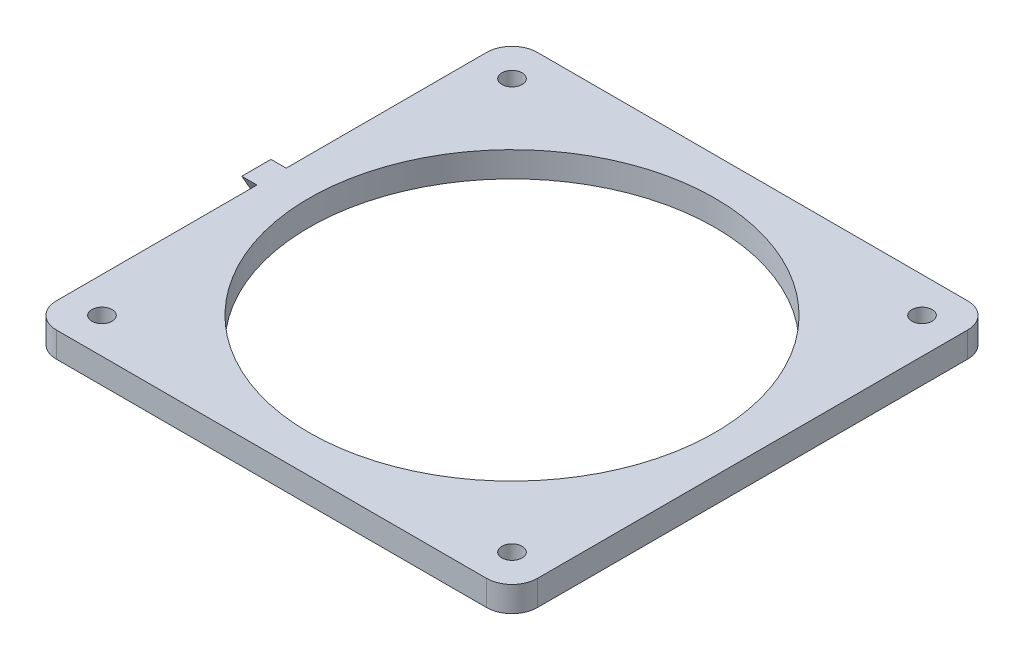
ISO-10303-21;
HEADER;
FILE_DESCRIPTION(('STEP AP214'),'2;1');
FILE_NAME('part.step','',(''),(''),'','','');
FILE_SCHEMA(('AUTOMOTIVE_DESIGN { 1 0 10303 214 1 1 1 1 }'));
ENDSEC;
DATA;
#1=APPLICATION_CONTEXT('core data for automotive mechanical design processes');
#2=APPLICATION_PROTOCOL_DEFINITION('international standard','automotive_design',2000,#1);
#3=PRODUCT_CONTEXT('',#1,'mechanical');
#4=PRODUCT('Part','Part','',(#3));
#5=PRODUCT_RELATED_PRODUCT_CATEGORY('part','',(#4));
#6=PRODUCT_DEFINITION_FORMATION('','',#4);
#7=PRODUCT_DEFINITION_CONTEXT('part definition',#1,'design');
#8=PRODUCT_DEFINITION('design','',#6,#7);
#9=PRODUCT_DEFINITION_SHAPE('','',#8);
#10=(LENGTH_UNIT() NAMED_UNIT(*) SI_UNIT(.MILLI.,.METRE.));
#11=(NAMED_UNIT(*) PLANE_ANGLE_UNIT() SI_UNIT($,.RADIAN.));
#12=(NAMED_UNIT(*) SI_UNIT($,.STERADIAN.) SOLID_ANGLE_UNIT());
#13=UNCERTAINTY_MEASURE_WITH_UNIT(LENGTH_MEASURE(1.E-05),#10,'distance_accuracy_value','');
#14=(GEOMETRIC_REPRESENTATION_CONTEXT(3) GLOBAL_UNCERTAINTY_ASSIGNED_CONTEXT((#13)) GLOBAL_UNIT_ASSIGNED_CONTEXT((#10,
#11,#12)) REPRESENTATION_CONTEXT('',''));
#15=CARTESIAN_POINT('',(0.,0.,0.));
#16=DIRECTION('',(0.,0.,1.));
#17=DIRECTION('',(1.,0.,0.));
#18=AXIS2_PLACEMENT_3D('',#15,#16,#17);
#19=CARTESIAN_POINT('',(-47.5,5.,0.));
#20=DIRECTION('',(-1.,0.,0.));
#21=DIRECTION('',(0.,0.,1.));
#22=AXIS2_PLACEMENT_3D('',#19,#20,#21);
#23=PLANE('',#22);
#24=DIRECTION('',(0.,0.,-1.));
#25=VECTOR('',#24,1.);
#26=CARTESIAN_POINT('',(-47.5,0.,0.));
#27=LINE('',#26,#25);
#28=CARTESIAN_POINT('',(-47.5,0.,42.5));
#29=VERTEX_POINT('',#28);
#30=CARTESIAN_POINT('',(-47.5,0.,0.));
#31=VERTEX_POINT('',#30);
#32=EDGE_CURVE('E185',#29,#31,#27,.T.);
#33=ORIENTED_EDGE('',*,*,#32,.F.);
#34=DIRECTION('',(0.,-1.,0.));
#35=VECTOR('',#34,1.);
#36=CARTESIAN_POINT('',(-47.5,5.,42.5));
#37=LINE('',#36,#35);
#38=CARTESIAN_POINT('',(-47.5,5.,42.5));
#39=VERTEX_POINT('',#38);
#40=EDGE_CURVE('E11',#29,#39,#37,.F.);
#41=ORIENTED_EDGE('',*,*,#40,.T.);
#42=DIRECTION('',(0.,0.,-1.));
#43=VECTOR('',#42,1.);
#44=CARTESIAN_POINT('',(-47.5,5.,0.));
#45=LINE('',#44,#43);
#46=CARTESIAN_POINT('',(-47.5,5.,2.88675134594816));
#47=VERTEX_POINT('',#46);
#48=EDGE_CURVE('E194',#39,#47,#45,.T.);
#49=ORIENTED_EDGE('',*,*,#48,.T.);
#50=DIRECTION('',(0.,0.866025403784435,0.500000000000005));
#51=VECTOR('',#50,1.);
#52=CARTESIAN_POINT('',(-47.5,5.,2.88675134594816));
#53=LINE('',#52,#51);
#54=EDGE_CURVE('E150',#31,#47,#53,.T.);
#55=ORIENTED_EDGE('',*,*,#54,.F.);
#56=EDGE_LOOP('',(#33,#41,#49,#55));
#57=FACE_BOUND('',#56,.T.);
#58=ADVANCED_FACE('F41',(#57),#23,.T.);
#59=CARTESIAN_POINT('',(0.,5.,0.));
#60=DIRECTION('',(0.,1.,0.));
#61=DIRECTION('',(0.,0.,1.));
#62=AXIS2_PLACEMENT_3D('',#59,#60,#61);
#63=PLANE('',#62);
#64=CARTESIAN_POINT('',(-40.5,5.,40.5));
#65=DIRECTION('',(0.,-1.,0.));
#66=DIRECTION('',(0.,0.,-1.));
#67=AXIS2_PLACEMENT_3D('',#64,#65,#66);
#68=CIRCLE('',#67,2.);
#69=CARTESIAN_POINT('',(-40.5,5.,38.5));
#70=VERTEX_POINT('',#69);
#71=EDGE_CURVE('E154',#70,#70,#68,.T.);
#72=ORIENTED_EDGE('',*,*,#71,.T.);
#73=EDGE_LOOP('',(#72));
#74=FACE_BOUND('',#73,.T.);
#75=CARTESIAN_POINT('',(40.5,5.,40.5));
#76=DIRECTION('',(0.,-1.,0.));
#77=DIRECTION('',(0.,0.,-1.));
#78=AXIS2_PLACEMENT_3D('',#75,#76,#77);
#79=CIRCLE('',#78,2.);
#80=CARTESIAN_POINT('',(40.5,5.,38.5));
#81=VERTEX_POINT('',#80);
#82=EDGE_CURVE('E165',#81,#81,#79,.T.);
#83=ORIENTED_EDGE('',*,*,#82,.T.);
#84=EDGE_LOOP('',(#83));
#85=FACE_BOUND('',#84,.T.);
#86=CARTESIAN_POINT('',(40.5,5.,-40.5));
#87=DIRECTION('',(0.,-1.,0.));
#88=DIRECTION('',(0.,0.,-1.));
#89=AXIS2_PLACEMENT_3D('',#86,#87,#88);
#90=CIRCLE('',#89,2.);
#91=CARTESIAN_POINT('',(40.5,5.,-42.5));
#92=VERTEX_POINT('',#91);
#93=EDGE_CURVE('E171',#92,#92,#90,.T.);
#94=ORIENTED_EDGE('',*,*,#93,.T.);
#95=EDGE_LOOP('',(#94));
#96=FACE_BOUND('',#95,.T.);
#97=DIRECTION('',(1.,0.,0.));
#98=VECTOR('',#97,1.);
#99=CARTESIAN_POINT('',(0.,5.,-47.5));
#100=LINE('',#99,#98);
#101=CARTESIAN_POINT('',(-42.5,5.,-47.5));
#102=VERTEX_POINT('',#101);
#103=CARTESIAN_POINT('',(42.5,5.,-47.5));
#104=VERTEX_POINT('',#103);
#105=EDGE_CURVE('E190',#102,#104,#100,.T.);
#106=ORIENTED_EDGE('',*,*,#105,.F.);
#107=CARTESIAN_POINT('',(-42.5,5.,-42.5));
#108=DIRECTION('',(0.,1.,0.));
#109=DIRECTION('',(0.,0.,1.));
#110=AXIS2_PLACEMENT_3D('',#107,#108,#109);
#111=CIRCLE('',#110,5.);
#112=CARTESIAN_POINT('',(-47.5,5.,-42.5));
#113=VERTEX_POINT('',#112);
#114=EDGE_CURVE('E230',#102,#113,#111,.T.);
#115=ORIENTED_EDGE('',*,*,#114,.T.);
#116=CARTESIAN_POINT('',(-47.5,5.,-2.88675134594817));
#117=VERTEX_POINT('',#116);
#118=EDGE_CURVE('E193',#117,#113,#45,.T.);
#119=ORIENTED_EDGE('',*,*,#118,.F.);
#120=DIRECTION('',(1.,0.,0.));
#121=VECTOR('',#120,1.);
#122=CARTESIAN_POINT('',(-50.5,5.,-2.88675134594817));
#123=LINE('',#122,#121);
#124=CARTESIAN_POINT('',(-50.5,5.,-2.88675134594817));
#125=VERTEX_POINT('',#124);
#126=EDGE_CURVE('E135',#125,#117,#123,.T.);
#127=ORIENTED_EDGE('',*,*,#126,.F.);
#128=DIRECTION('',(0.,0.,-1.));
#129=VECTOR('',#128,1.);
#130=CARTESIAN_POINT('',(-50.5,5.,-2.88675134594817));
#131=LINE('',#130,#129);
#132=CARTESIAN_POINT('',(-50.5,5.,2.88675134594816));
#133=VERTEX_POINT('',#132);
#134=EDGE_CURVE('E125',#133,#125,#131,.T.);
#135=ORIENTED_EDGE('',*,*,#134,.F.);
#136=DIRECTION('',(1.,0.,0.));
#137=VECTOR('',#136,1.);
#138=CARTESIAN_POINT('',(-50.5,5.,2.88675134594816));
#139=LINE('',#138,#137);
#140=EDGE_CURVE('E131',#133,#47,#139,.T.);
#141=ORIENTED_EDGE('',*,*,#140,.T.);
#142=ORIENTED_EDGE('',*,*,#48,.F.);
#143=CARTESIAN_POINT('',(-42.5,5.,42.5));
#144=DIRECTION('',(0.,1.,0.));
#145=DIRECTION('',(0.,0.,1.));
#146=AXIS2_PLACEMENT_3D('',#143,#144,#145);
#147=CIRCLE('',#146,5.);
#148=CARTESIAN_POINT('',(-42.5,5.,47.5));
#149=VERTEX_POINT('',#148);
#150=EDGE_CURVE('E224',#39,#149,#147,.T.);
#151=ORIENTED_EDGE('',*,*,#150,.T.);
#152=DIRECTION('',(1.,0.,0.));
#153=VECTOR('',#152,1.);
#154=CARTESIAN_POINT('',(0.,5.,47.5));
#155=LINE('',#154,#153);
#156=CARTESIAN_POINT('',(42.5,5.,47.5));
#157=VERTEX_POINT('',#156);
#158=EDGE_CURVE('E184',#149,#157,#155,.T.);
#159=ORIENTED_EDGE('',*,*,#158,.T.);
#160=CARTESIAN_POINT('',(42.5,5.,42.5));
#161=DIRECTION('',(0.,1.,0.));
#162=DIRECTION('',(0.,0.,1.));
#163=AXIS2_PLACEMENT_3D('',#160,#161,#162);
#164=CIRCLE('',#163,5.);
#165=CARTESIAN_POINT('',(47.5,5.,42.5));
#166=VERTEX_POINT('',#165);
#167=EDGE_CURVE('E226',#157,#166,#164,.T.);
#168=ORIENTED_EDGE('',*,*,#167,.T.);
#169=DIRECTION('',(0.,0.,-1.));
#170=VECTOR('',#169,1.);
#171=CARTESIAN_POINT('',(47.5,5.,0.));
#172=LINE('',#171,#170);
#173=CARTESIAN_POINT('',(47.5,5.,-42.5));
#174=VERTEX_POINT('',#173);
#175=EDGE_CURVE('E188',#166,#174,#172,.T.);
#176=ORIENTED_EDGE('',*,*,#175,.T.);
#177=CARTESIAN_POINT('',(42.5,5.,-42.5));
#178=DIRECTION('',(0.,1.,0.));
#179=DIRECTION('',(0.,0.,1.));
#180=AXIS2_PLACEMENT_3D('',#177,#178,#179);
#181=CIRCLE('',#180,5.);
#182=EDGE_CURVE('E228',#174,#104,#181,.T.);
#183=ORIENTED_EDGE('',*,*,#182,.T.);
#184=EDGE_LOOP('',(#106,#115,#119,#127,#135,#141,#142,#151,#159,#168,#176,#183));
#185=FACE_BOUND('',#184,.T.);
#186=CARTESIAN_POINT('',(0.,5.,0.));
#187=DIRECTION('',(0.,1.,0.));
#188=DIRECTION('',(0.,0.,1.));
#189=AXIS2_PLACEMENT_3D('',#186,#187,#188);
#190=CIRCLE('',#189,40.1);
#191=CARTESIAN_POINT('',(0.,5.,40.1));
#192=VERTEX_POINT('',#191);
#193=EDGE_CURVE('E181',#192,#192,#190,.T.);
#194=ORIENTED_EDGE('',*,*,#193,.F.);
#195=EDGE_LOOP('',(#194));
#196=FACE_BOUND('',#195,.T.);
#197=CARTESIAN_POINT('',(-40.5,5.,-40.5));
#198=DIRECTION('',(0.,-1.,0.));
#199=DIRECTION('',(0.,0.,-1.));
#200=AXIS2_PLACEMENT_3D('',#197,#198,#199);
#201=CIRCLE('',#200,2.);
#202=CARTESIAN_POINT('',(-40.5,5.,-42.5));
#203=VERTEX_POINT('',#202);
#204=EDGE_CURVE('E177',#203,#203,#201,.T.);
#205=ORIENTED_EDGE('',*,*,#204,.T.);
#206=EDGE_LOOP('',(#205));
#207=FACE_BOUND('',#206,.T.);
#208=ADVANCED_FACE('F128',(#74,#85,#96,#185,#196,#207),#63,.T.);
#209=CARTESIAN_POINT('',(0.,5.,47.5));
#210=DIRECTION('',(0.,0.,-1.));
#211=DIRECTION('',(-1.,0.,0.));
#212=AXIS2_PLACEMENT_3D('',#209,#210,#211);
#213=PLANE('',#212);
#214=DIRECTION('',(1.,0.,0.));
#215=VECTOR('',#214,1.);
#216=CARTESIAN_POINT('',(0.,0.,47.5));
#217=LINE('',#216,#215);
#218=CARTESIAN_POINT('',(-42.5,0.,47.5));
#219=VERTEX_POINT('',#218);
#220=CARTESIAN_POINT('',(42.5,0.,47.5));
#221=VERTEX_POINT('',#220);
#222=EDGE_CURVE('E199',#219,#221,#217,.T.);
#223=ORIENTED_EDGE('',*,*,#222,.T.);
#224=DIRECTION('',(0.,-1.,0.));
#225=VECTOR('',#224,1.);
#226=CARTESIAN_POINT('',(42.5,5.,47.5));
#227=LINE('',#226,#225);
#228=EDGE_CURVE('E49',#221,#157,#227,.F.);
#229=ORIENTED_EDGE('',*,*,#228,.T.);
#230=ORIENTED_EDGE('',*,*,#158,.F.);
#231=DIRECTION('',(0.,-1.,0.));
#232=VECTOR('',#231,1.);
#233=CARTESIAN_POINT('',(-42.5,0.,47.5));
#234=LINE('',#233,#232);
#235=EDGE_CURVE('E236',#149,#219,#234,.T.);
#236=ORIENTED_EDGE('',*,*,#235,.T.);
#237=EDGE_LOOP('',(#223,#229,#230,#236));
#238=FACE_BOUND('',#237,.T.);
#239=ADVANCED_FACE('F241',(#238),#213,.F.);
#240=CARTESIAN_POINT('',(47.5,5.,0.));
#241=DIRECTION('',(-1.,0.,0.));
#242=DIRECTION('',(0.,0.,1.));
#243=AXIS2_PLACEMENT_3D('',#240,#241,#242);
#244=PLANE('',#243);
#245=DIRECTION('',(0.,0.,-1.));
#246=VECTOR('',#245,1.);
#247=CARTESIAN_POINT('',(47.5,0.,0.));
#248=LINE('',#247,#246);
#249=CARTESIAN_POINT('',(47.5,0.,42.5));
#250=VERTEX_POINT('',#249);
#251=CARTESIAN_POINT('',(47.5,0.,-42.5));
#252=VERTEX_POINT('',#251);
#253=EDGE_CURVE('E202',#250,#252,#248,.T.);
#254=ORIENTED_EDGE('',*,*,#253,.T.);
#255=DIRECTION('',(0.,-1.,0.));
#256=VECTOR('',#255,1.);
#257=CARTESIAN_POINT('',(47.5,5.,-42.5));
#258=LINE('',#257,#256);
#259=EDGE_CURVE('E62',#252,#174,#258,.F.);
#260=ORIENTED_EDGE('',*,*,#259,.T.);
#261=ORIENTED_EDGE('',*,*,#175,.F.);
#262=DIRECTION('',(0.,-1.,0.));
#263=VECTOR('',#262,1.);
#264=CARTESIAN_POINT('',(47.5,5.,42.5));
#265=LINE('',#264,#263);
#266=EDGE_CURVE('E232',#166,#250,#265,.T.);
#267=ORIENTED_EDGE('',*,*,#266,.T.);
#268=EDGE_LOOP('',(#254,#260,#261,#267));
#269=FACE_BOUND('',#268,.T.);
#270=ADVANCED_FACE('F250',(#269),#244,.F.);
#271=CARTESIAN_POINT('',(0.,5.,-47.5));
#272=DIRECTION('',(0.,0.,-1.));
#273=DIRECTION('',(-1.,0.,0.));
#274=AXIS2_PLACEMENT_3D('',#271,#272,#273);
#275=PLANE('',#274);
#276=DIRECTION('',(1.,0.,0.));
#277=VECTOR('',#276,1.);
#278=CARTESIAN_POINT('',(0.,0.,-47.5));
#279=LINE('',#278,#277);
#280=CARTESIAN_POINT('',(-42.5,0.,-47.5));
#281=VERTEX_POINT('',#280);
#282=CARTESIAN_POINT('',(42.5,0.,-47.5));
#283=VERTEX_POINT('',#282);
#284=EDGE_CURVE('E204',#281,#283,#279,.T.);
#285=ORIENTED_EDGE('',*,*,#284,.F.);
#286=DIRECTION('',(0.,-1.,0.));
#287=VECTOR('',#286,1.);
#288=CARTESIAN_POINT('',(-42.5,5.,-47.5));
#289=LINE('',#288,#287);
#290=EDGE_CURVE('E222',#281,#102,#289,.F.);
#291=ORIENTED_EDGE('',*,*,#290,.T.);
#292=ORIENTED_EDGE('',*,*,#105,.T.);
#293=DIRECTION('',(0.,-1.,0.));
#294=VECTOR('',#293,1.);
#295=CARTESIAN_POINT('',(42.5,0.,-47.5));
#296=LINE('',#295,#294);
#297=EDGE_CURVE('E219',#104,#283,#296,.T.);
#298=ORIENTED_EDGE('',*,*,#297,.T.);
#299=EDGE_LOOP('',(#285,#291,#292,#298));
#300=FACE_BOUND('',#299,.T.);
#301=ADVANCED_FACE('F260',(#300),#275,.T.);
#302=CARTESIAN_POINT('',(0.,5.,0.));
#303=DIRECTION('',(0.,-1.,0.));
#304=DIRECTION('',(0.,0.,-1.));
#305=AXIS2_PLACEMENT_3D('',#302,#303,#304);
#306=CYLINDRICAL_SURFACE('',#305,40.1);
#307=ORIENTED_EDGE('',*,*,#193,.T.);
#308=EDGE_LOOP('',(#307));
#309=FACE_BOUND('',#308,.T.);
#310=CARTESIAN_POINT('',(0.,0.,0.));
#311=DIRECTION('',(0.,1.,0.));
#312=DIRECTION('',(0.,0.,1.));
#313=AXIS2_PLACEMENT_3D('',#310,#311,#312);
#314=CIRCLE('',#313,40.1);
#315=CARTESIAN_POINT('',(0.,0.,40.1));
#316=VERTEX_POINT('',#315);
#317=EDGE_CURVE('E180',#316,#316,#314,.T.);
#318=ORIENTED_EDGE('',*,*,#317,.F.);
#319=EDGE_LOOP('',(#318));
#320=FACE_BOUND('',#319,.T.);
#321=ADVANCED_FACE('F287',(#309,#320),#306,.F.);
#322=ORIENTED_EDGE('',*,*,#118,.T.);
#323=DIRECTION('',(0.,-1.,0.));
#324=VECTOR('',#323,1.);
#325=CARTESIAN_POINT('',(-47.5,5.,-42.5));
#326=LINE('',#325,#324);
#327=CARTESIAN_POINT('',(-47.5,0.,-42.5));
#328=VERTEX_POINT('',#327);
#329=EDGE_CURVE('E196',#113,#328,#326,.T.);
#330=ORIENTED_EDGE('',*,*,#329,.T.);
#331=EDGE_CURVE('E207',#31,#328,#27,.T.);
#332=ORIENTED_EDGE('',*,*,#331,.F.);
#333=DIRECTION('',(0.,-0.866025403784436,0.500000000000004));
#334=VECTOR('',#333,1.);
#335=CARTESIAN_POINT('',(-47.5,0.,0.));
#336=LINE('',#335,#334);
#337=EDGE_CURVE('E146',#117,#31,#336,.T.);
#338=ORIENTED_EDGE('',*,*,#337,.F.);
#339=EDGE_LOOP('',(#322,#330,#332,#338));
#340=FACE_BOUND('',#339,.T.);
#341=ADVANCED_FACE('F269',(#340),#23,.T.);
#342=CARTESIAN_POINT('',(0.,0.,0.));
#343=DIRECTION('',(0.,1.,0.));
#344=DIRECTION('',(0.,0.,1.));
#345=AXIS2_PLACEMENT_3D('',#342,#343,#344);
#346=PLANE('',#345);
#347=CARTESIAN_POINT('',(-40.5,0.,40.5));
#348=DIRECTION('',(0.,-1.,0.));
#349=DIRECTION('',(0.,0.,-1.));
#350=AXIS2_PLACEMENT_3D('',#347,#348,#349);
#351=CIRCLE('',#350,1.99999999999999);
#352=CARTESIAN_POINT('',(-40.5,0.,38.5));
#353=VERTEX_POINT('',#352);
#354=EDGE_CURVE('E151',#353,#353,#351,.T.);
#355=ORIENTED_EDGE('',*,*,#354,.F.);
#356=EDGE_LOOP('',(#355));
#357=FACE_BOUND('',#356,.T.);
#358=CARTESIAN_POINT('',(40.5,0.,40.5));
#359=DIRECTION('',(0.,-1.,0.));
#360=DIRECTION('',(0.,0.,-1.));
#361=AXIS2_PLACEMENT_3D('',#358,#359,#360);
#362=CIRCLE('',#361,1.99999999999999);
#363=CARTESIAN_POINT('',(40.5,0.,38.5));
#364=VERTEX_POINT('',#363);
#365=EDGE_CURVE('E162',#364,#364,#362,.T.);
#366=ORIENTED_EDGE('',*,*,#365,.F.);
#367=EDGE_LOOP('',(#366));
#368=FACE_BOUND('',#367,.T.);
#369=CARTESIAN_POINT('',(40.5,0.,-40.5));
#370=DIRECTION('',(0.,-1.,0.));
#371=DIRECTION('',(0.,0.,-1.));
#372=AXIS2_PLACEMENT_3D('',#369,#370,#371);
#373=CIRCLE('',#372,1.99999999999999);
#374=CARTESIAN_POINT('',(40.5,0.,-42.5));
#375=VERTEX_POINT('',#374);
#376=EDGE_CURVE('E168',#375,#375,#373,.T.);
#377=ORIENTED_EDGE('',*,*,#376,.F.);
#378=EDGE_LOOP('',(#377));
#379=FACE_BOUND('',#378,.T.);
#380=CARTESIAN_POINT('',(-40.5,0.,-40.5));
#381=DIRECTION('',(0.,-1.,0.));
#382=DIRECTION('',(0.,0.,-1.));
#383=AXIS2_PLACEMENT_3D('',#380,#381,#382);
#384=CIRCLE('',#383,1.99999999999999);
#385=CARTESIAN_POINT('',(-40.5,0.,-42.5));
#386=VERTEX_POINT('',#385);
#387=EDGE_CURVE('E174',#386,#386,#384,.T.);
#388=ORIENTED_EDGE('',*,*,#387,.F.);
#389=EDGE_LOOP('',(#388));
#390=FACE_BOUND('',#389,.T.);
#391=ORIENTED_EDGE('',*,*,#317,.T.);
#392=EDGE_LOOP('',(#391));
#393=FACE_BOUND('',#392,.T.);
#394=ORIENTED_EDGE('',*,*,#331,.T.);
#395=CARTESIAN_POINT('',(-42.5,0.,-42.5));
#396=DIRECTION('',(0.,1.,0.));
#397=DIRECTION('',(0.,0.,1.));
#398=AXIS2_PLACEMENT_3D('',#395,#396,#397);
#399=CIRCLE('',#398,5.);
#400=EDGE_CURVE('E217',#328,#281,#399,.F.);
#401=ORIENTED_EDGE('',*,*,#400,.T.);
#402=ORIENTED_EDGE('',*,*,#284,.T.);
#403=CARTESIAN_POINT('',(42.5,0.,-42.5));
#404=DIRECTION('',(0.,1.,0.));
#405=DIRECTION('',(0.,0.,1.));
#406=AXIS2_PLACEMENT_3D('',#403,#404,#405);
#407=CIRCLE('',#406,5.);
#408=EDGE_CURVE('E215',#283,#252,#407,.F.);
#409=ORIENTED_EDGE('',*,*,#408,.T.);
#410=ORIENTED_EDGE('',*,*,#253,.F.);
#411=CARTESIAN_POINT('',(42.5,0.,42.5));
#412=DIRECTION('',(0.,1.,0.));
#413=DIRECTION('',(0.,0.,1.));
#414=AXIS2_PLACEMENT_3D('',#411,#412,#413);
#415=CIRCLE('',#414,5.);
#416=EDGE_CURVE('E213',#250,#221,#415,.F.);
#417=ORIENTED_EDGE('',*,*,#416,.T.);
#418=ORIENTED_EDGE('',*,*,#222,.F.);
#419=CARTESIAN_POINT('',(-42.5,0.,42.5));
#420=DIRECTION('',(0.,1.,0.));
#421=DIRECTION('',(0.,0.,1.));
#422=AXIS2_PLACEMENT_3D('',#419,#420,#421);
#423=CIRCLE('',#422,5.);
#424=EDGE_CURVE('E211',#219,#29,#423,.F.);
#425=ORIENTED_EDGE('',*,*,#424,.T.);
#426=ORIENTED_EDGE('',*,*,#32,.T.);
#427=EDGE_LOOP('',(#394,#401,#402,#409,#410,#417,#418,#425,#426));
#428=FACE_BOUND('',#427,.T.);
#429=ADVANCED_FACE('F253',(#357,#368,#379,#390,#393,#428),#346,.F.);
#430=CARTESIAN_POINT('',(-40.5,0.,-40.5));
#431=DIRECTION('',(0.,-1.,0.));
#432=DIRECTION('',(0.,0.,-1.));
#433=AXIS2_PLACEMENT_3D('',#430,#431,#432);
#434=CYLINDRICAL_SURFACE('',#433,1.99999999999999);
#435=ORIENTED_EDGE('',*,*,#204,.F.);
#436=EDGE_LOOP('',(#435));
#437=FACE_BOUND('',#436,.T.);
#438=ORIENTED_EDGE('',*,*,#387,.T.);
#439=EDGE_LOOP('',(#438));
#440=FACE_BOUND('',#439,.T.);
#441=ADVANCED_FACE('F292',(#437,#440),#434,.F.);
#442=CARTESIAN_POINT('',(40.5,0.,-40.5));
#443=DIRECTION('',(0.,-1.,0.));
#444=DIRECTION('',(0.,0.,-1.));
#445=AXIS2_PLACEMENT_3D('',#442,#443,#444);
#446=CYLINDRICAL_SURFACE('',#445,1.99999999999999);
#447=ORIENTED_EDGE('',*,*,#93,.F.);
#448=EDGE_LOOP('',(#447));
#449=FACE_BOUND('',#448,.T.);
#450=ORIENTED_EDGE('',*,*,#376,.T.);
#451=EDGE_LOOP('',(#450));
#452=FACE_BOUND('',#451,.T.);
#453=ADVANCED_FACE('F381',(#449,#452),#446,.F.);
#454=CARTESIAN_POINT('',(40.5,0.,40.5));
#455=DIRECTION('',(0.,-1.,0.));
#456=DIRECTION('',(0.,0.,-1.));
#457=AXIS2_PLACEMENT_3D('',#454,#455,#456);
#458=CYLINDRICAL_SURFACE('',#457,1.99999999999999);
#459=ORIENTED_EDGE('',*,*,#82,.F.);
#460=EDGE_LOOP('',(#459));
#461=FACE_BOUND('',#460,.T.);
#462=ORIENTED_EDGE('',*,*,#365,.T.);
#463=EDGE_LOOP('',(#462));
#464=FACE_BOUND('',#463,.T.);
#465=ADVANCED_FACE('F372',(#461,#464),#458,.F.);
#466=CARTESIAN_POINT('',(-40.5,0.,40.5));
#467=DIRECTION('',(0.,-1.,0.));
#468=DIRECTION('',(0.,0.,-1.));
#469=AXIS2_PLACEMENT_3D('',#466,#467,#468);
#470=CYLINDRICAL_SURFACE('',#469,1.99999999999999);
#471=ORIENTED_EDGE('',*,*,#71,.F.);
#472=EDGE_LOOP('',(#471));
#473=FACE_BOUND('',#472,.T.);
#474=ORIENTED_EDGE('',*,*,#354,.T.);
#475=EDGE_LOOP('',(#474));
#476=FACE_BOUND('',#475,.T.);
#477=ADVANCED_FACE('F350',(#473,#476),#470,.F.);
#478=CARTESIAN_POINT('',(-50.5,5.,2.88675134594816));
#479=DIRECTION('',(0.,0.500000000000005,-0.866025403784435));
#480=DIRECTION('',(0.,0.866025403784435,0.500000000000005));
#481=AXIS2_PLACEMENT_3D('',#478,#479,#480);
#482=PLANE('',#481);
#483=ORIENTED_EDGE('',*,*,#54,.T.);
#484=ORIENTED_EDGE('',*,*,#140,.F.);
#485=DIRECTION('',(0.,0.866025403784435,0.500000000000005));
#486=VECTOR('',#485,1.);
#487=CARTESIAN_POINT('',(-50.5,5.,2.88675134594816));
#488=LINE('',#487,#486);
#489=CARTESIAN_POINT('',(-50.5,0.,0.));
#490=VERTEX_POINT('',#489);
#491=EDGE_CURVE('E139',#490,#133,#488,.T.);
#492=ORIENTED_EDGE('',*,*,#491,.F.);
#493=DIRECTION('',(1.,0.,0.));
#494=VECTOR('',#493,1.);
#495=CARTESIAN_POINT('',(-50.5,0.,0.));
#496=LINE('',#495,#494);
#497=EDGE_CURVE('E156',#490,#31,#496,.T.);
#498=ORIENTED_EDGE('',*,*,#497,.T.);
#499=EDGE_LOOP('',(#483,#484,#492,#498));
#500=FACE_BOUND('',#499,.T.);
#501=ADVANCED_FACE('F148',(#500),#482,.F.);
#502=CARTESIAN_POINT('',(-50.5,0.,0.));
#503=DIRECTION('',(0.,0.500000000000004,0.866025403784436));
#504=DIRECTION('',(0.,-0.866025403784436,0.500000000000004));
#505=AXIS2_PLACEMENT_3D('',#502,#503,#504);
#506=PLANE('',#505);
#507=ORIENTED_EDGE('',*,*,#337,.T.);
#508=ORIENTED_EDGE('',*,*,#497,.F.);
#509=DIRECTION('',(0.,-0.866025403784436,0.500000000000004));
#510=VECTOR('',#509,1.);
#511=CARTESIAN_POINT('',(-50.5,0.,0.));
#512=LINE('',#511,#510);
#513=EDGE_CURVE('E138',#125,#490,#512,.T.);
#514=ORIENTED_EDGE('',*,*,#513,.F.);
#515=ORIENTED_EDGE('',*,*,#126,.T.);
#516=EDGE_LOOP('',(#507,#508,#514,#515));
#517=FACE_BOUND('',#516,.T.);
#518=ADVANCED_FACE('F334',(#517),#506,.F.);
#519=CARTESIAN_POINT('',(-50.5,0.,0.));
#520=DIRECTION('',(1.,0.,0.));
#521=DIRECTION('',(0.,0.,-1.));
#522=AXIS2_PLACEMENT_3D('',#519,#520,#521);
#523=PLANE('',#522);
#524=ORIENTED_EDGE('',*,*,#491,.T.);
#525=ORIENTED_EDGE('',*,*,#134,.T.);
#526=ORIENTED_EDGE('',*,*,#513,.T.);
#527=EDGE_LOOP('',(#524,#525,#526));
#528=FACE_BOUND('',#527,.T.);
#529=ADVANCED_FACE('F142',(#528),#523,.F.);
#530=CARTESIAN_POINT('',(-42.5,5.,-42.5));
#531=DIRECTION('',(0.,-1.,0.));
#532=DIRECTION('',(0.,0.,-1.));
#533=AXIS2_PLACEMENT_3D('',#530,#531,#532);
#534=CYLINDRICAL_SURFACE('',#533,5.);
#535=ORIENTED_EDGE('',*,*,#114,.F.);
#536=ORIENTED_EDGE('',*,*,#290,.F.);
#537=ORIENTED_EDGE('',*,*,#400,.F.);
#538=ORIENTED_EDGE('',*,*,#329,.F.);
#539=EDGE_LOOP('',(#535,#536,#537,#538));
#540=FACE_BOUND('',#539,.T.);
#541=ADVANCED_FACE('F266',(#540),#534,.T.);
#542=CARTESIAN_POINT('',(42.5,5.,-42.5));
#543=DIRECTION('',(0.,1.,0.));
#544=DIRECTION('',(0.,0.,1.));
#545=AXIS2_PLACEMENT_3D('',#542,#543,#544);
#546=CYLINDRICAL_SURFACE('',#545,5.);
#547=ORIENTED_EDGE('',*,*,#182,.F.);
#548=ORIENTED_EDGE('',*,*,#259,.F.);
#549=ORIENTED_EDGE('',*,*,#408,.F.);
#550=ORIENTED_EDGE('',*,*,#297,.F.);
#551=EDGE_LOOP('',(#547,#548,#549,#550));
#552=FACE_BOUND('',#551,.T.);
#553=ADVANCED_FACE('F258',(#552),#546,.T.);
#554=CARTESIAN_POINT('',(42.5,5.,42.5));
#555=DIRECTION('',(0.,-1.,0.));
#556=DIRECTION('',(0.,0.,-1.));
#557=AXIS2_PLACEMENT_3D('',#554,#555,#556);
#558=CYLINDRICAL_SURFACE('',#557,5.);
#559=ORIENTED_EDGE('',*,*,#167,.F.);
#560=ORIENTED_EDGE('',*,*,#228,.F.);
#561=ORIENTED_EDGE('',*,*,#416,.F.);
#562=ORIENTED_EDGE('',*,*,#266,.F.);
#563=EDGE_LOOP('',(#559,#560,#561,#562));
#564=FACE_BOUND('',#563,.T.);
#565=ADVANCED_FACE('F248',(#564),#558,.T.);
#566=CARTESIAN_POINT('',(-42.5,5.,42.5));
#567=DIRECTION('',(0.,1.,0.));
#568=DIRECTION('',(0.,0.,1.));
#569=AXIS2_PLACEMENT_3D('',#566,#567,#568);
#570=CYLINDRICAL_SURFACE('',#569,5.);
#571=ORIENTED_EDGE('',*,*,#150,.F.);
#572=ORIENTED_EDGE('',*,*,#40,.F.);
#573=ORIENTED_EDGE('',*,*,#424,.F.);
#574=ORIENTED_EDGE('',*,*,#235,.F.);
#575=EDGE_LOOP('',(#571,#572,#573,#574));
#576=FACE_BOUND('',#575,.T.);
#577=ADVANCED_FACE('F43',(#576),#570,.T.);
#578=CLOSED_SHELL('',(#58,#208,#239,#270,#301,#321,#341,#429,#441,#453,#465,#477,#501,#518,#529,
#541,#553,#565,#577));
#579=MANIFOLD_SOLID_BREP('B2',#578);
#580=ADVANCED_BREP_SHAPE_REPRESENTATION('',(#18,#579),#14);
#581=SHAPE_DEFINITION_REPRESENTATION(#9,#580);
ENDSEC;
END-ISO-10303-21;
